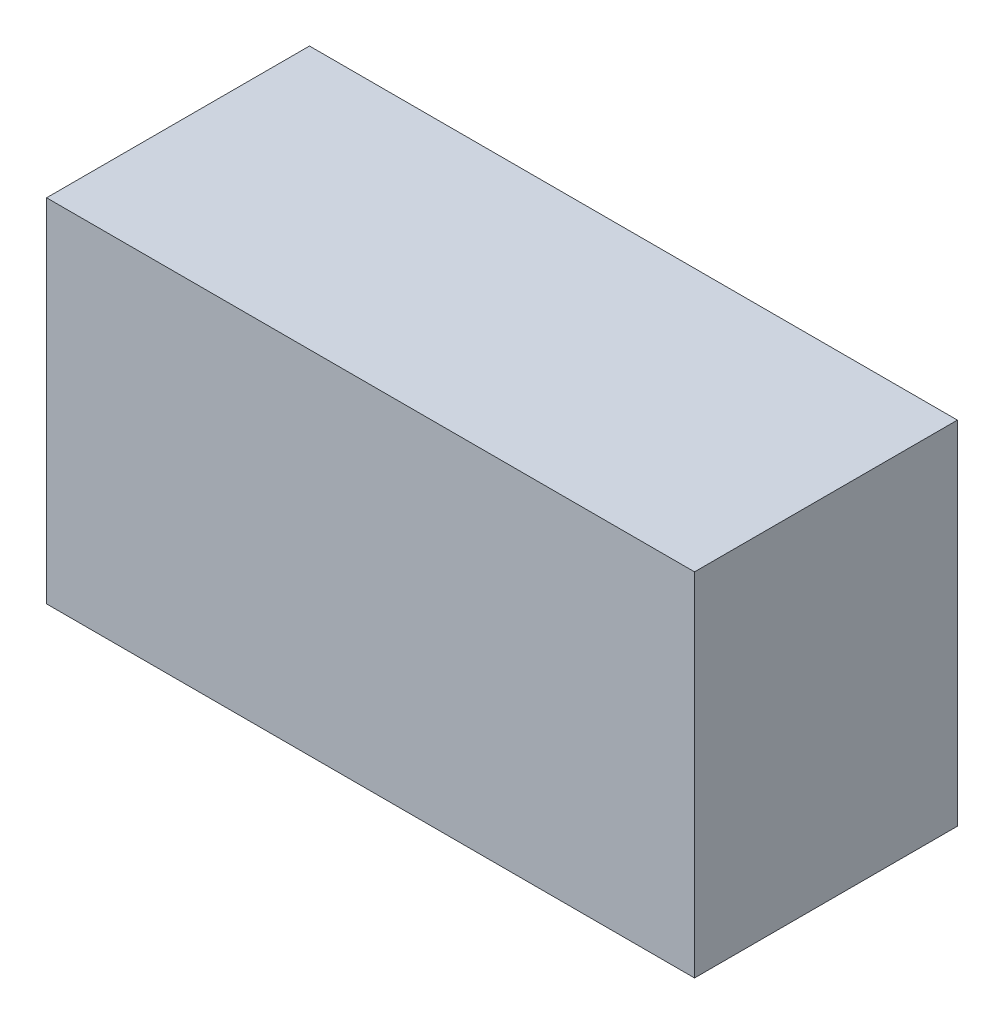
ISO-10303-21;
HEADER;
FILE_DESCRIPTION(('STEP AP214'),'2;1');
FILE_NAME('part.step','',(''),(''),'','','');
FILE_SCHEMA(('AUTOMOTIVE_DESIGN { 1 0 10303 214 1 1 1 1 }'));
ENDSEC;
DATA;
#1=APPLICATION_CONTEXT('core data for automotive mechanical design processes');
#2=APPLICATION_PROTOCOL_DEFINITION('international standard','automotive_design',2000,#1);
#3=PRODUCT_CONTEXT('',#1,'mechanical');
#4=PRODUCT('Part','Part','',(#3));
#5=PRODUCT_RELATED_PRODUCT_CATEGORY('part','',(#4));
#6=PRODUCT_DEFINITION_FORMATION('','',#4);
#7=PRODUCT_DEFINITION_CONTEXT('part definition',#1,'design');
#8=PRODUCT_DEFINITION('design','',#6,#7);
#9=PRODUCT_DEFINITION_SHAPE('','',#8);
#10=(LENGTH_UNIT() NAMED_UNIT(*) SI_UNIT(.MILLI.,.METRE.));
#11=(NAMED_UNIT(*) PLANE_ANGLE_UNIT() SI_UNIT($,.RADIAN.));
#12=(NAMED_UNIT(*) SI_UNIT($,.STERADIAN.) SOLID_ANGLE_UNIT());
#13=UNCERTAINTY_MEASURE_WITH_UNIT(LENGTH_MEASURE(1.E-05),#10,'distance_accuracy_value','');
#14=(GEOMETRIC_REPRESENTATION_CONTEXT(3) GLOBAL_UNCERTAINTY_ASSIGNED_CONTEXT((#13)) GLOBAL_UNIT_ASSIGNED_CONTEXT((#10,
#11,#12)) REPRESENTATION_CONTEXT('',''));
#15=CARTESIAN_POINT('',(0.,0.,0.));
#16=DIRECTION('',(0.,0.,1.));
#17=DIRECTION('',(1.,0.,0.));
#18=AXIS2_PLACEMENT_3D('',#15,#16,#17);
#19=CARTESIAN_POINT('',(-0.87499952,-0.47500032,0.));
#20=DIRECTION('',(0.,1.,0.));
#21=DIRECTION('',(1.,0.,0.));
#22=AXIS2_PLACEMENT_3D('',#19,#20,#21);
#23=PLANE('',#22);
#24=DIRECTION('',(1.,0.,0.));
#25=VECTOR('',#24,1.);
#26=CARTESIAN_POINT('',(-0.87499952,-0.47500032,0.));
#27=LINE('',#26,#25);
#28=CARTESIAN_POINT('',(-0.87499952,-0.47500032,0.));
#29=VERTEX_POINT('',#28);
#30=CARTESIAN_POINT('',(0.87499952,-0.47500032,0.));
#31=VERTEX_POINT('',#30);
#32=EDGE_CURVE('E9',#29,#31,#27,.T.);
#33=ORIENTED_EDGE('',*,*,#32,.T.);
#34=DIRECTION('',(0.,0.,1.));
#35=VECTOR('',#34,1.);
#36=CARTESIAN_POINT('',(0.87499952,-0.47500032,0.));
#37=LINE('',#36,#35);
#38=CARTESIAN_POINT('',(0.87499952,-0.47500032,0.71000112));
#39=VERTEX_POINT('',#38);
#40=EDGE_CURVE('E22',#31,#39,#37,.T.);
#41=ORIENTED_EDGE('',*,*,#40,.T.);
#42=DIRECTION('',(1.,0.,0.));
#43=VECTOR('',#42,1.);
#44=CARTESIAN_POINT('',(-0.87499952,-0.47500032,0.71000112));
#45=LINE('',#44,#43);
#46=CARTESIAN_POINT('',(-0.87499952,-0.47500032,0.71000112));
#47=VERTEX_POINT('',#46);
#48=EDGE_CURVE('E84',#47,#39,#45,.T.);
#49=ORIENTED_EDGE('',*,*,#48,.F.);
#50=DIRECTION('',(0.,0.,1.));
#51=VECTOR('',#50,1.);
#52=CARTESIAN_POINT('',(-0.87499952,-0.47500032,0.));
#53=LINE('',#52,#51);
#54=EDGE_CURVE('E32',#29,#47,#53,.T.);
#55=ORIENTED_EDGE('',*,*,#54,.F.);
#56=EDGE_LOOP('',(#33,#41,#49,#55));
#57=FACE_BOUND('',#56,.T.);
#58=ADVANCED_FACE('F15',(#57),#23,.F.);
#59=CARTESIAN_POINT('',(0.87499952,-0.47500032,0.));
#60=DIRECTION('',(-1.,0.,0.));
#61=DIRECTION('',(0.,1.,0.));
#62=AXIS2_PLACEMENT_3D('',#59,#60,#61);
#63=PLANE('',#62);
#64=DIRECTION('',(0.,1.,0.));
#65=VECTOR('',#64,1.);
#66=CARTESIAN_POINT('',(0.87499952,-0.47500032,0.));
#67=LINE('',#66,#65);
#68=CARTESIAN_POINT('',(0.87499952,0.47500032,0.));
#69=VERTEX_POINT('',#68);
#70=EDGE_CURVE('E81',#31,#69,#67,.T.);
#71=ORIENTED_EDGE('',*,*,#70,.T.);
#72=DIRECTION('',(0.,0.,1.));
#73=VECTOR('',#72,1.);
#74=CARTESIAN_POINT('',(0.87499952,0.47500032,0.));
#75=LINE('',#74,#73);
#76=CARTESIAN_POINT('',(0.87499952,0.47500032,0.71000112));
#77=VERTEX_POINT('',#76);
#78=EDGE_CURVE('E79',#69,#77,#75,.T.);
#79=ORIENTED_EDGE('',*,*,#78,.T.);
#80=DIRECTION('',(0.,1.,0.));
#81=VECTOR('',#80,1.);
#82=CARTESIAN_POINT('',(0.87499952,-0.47500032,0.71000112));
#83=LINE('',#82,#81);
#84=EDGE_CURVE('E58',#39,#77,#83,.T.);
#85=ORIENTED_EDGE('',*,*,#84,.F.);
#86=ORIENTED_EDGE('',*,*,#40,.F.);
#87=EDGE_LOOP('',(#71,#79,#85,#86));
#88=FACE_BOUND('',#87,.T.);
#89=ADVANCED_FACE('F87',(#88),#63,.F.);
#90=CARTESIAN_POINT('',(0.87499952,0.47500032,0.));
#91=DIRECTION('',(0.,-1.,0.));
#92=DIRECTION('',(-1.,0.,0.));
#93=AXIS2_PLACEMENT_3D('',#90,#91,#92);
#94=PLANE('',#93);
#95=DIRECTION('',(-1.,0.,0.));
#96=VECTOR('',#95,1.);
#97=CARTESIAN_POINT('',(0.87499952,0.47500032,0.));
#98=LINE('',#97,#96);
#99=CARTESIAN_POINT('',(-0.87499952,0.47500032,0.));
#100=VERTEX_POINT('',#99);
#101=EDGE_CURVE('E68',#69,#100,#98,.T.);
#102=ORIENTED_EDGE('',*,*,#101,.T.);
#103=DIRECTION('',(0.,0.,1.));
#104=VECTOR('',#103,1.);
#105=CARTESIAN_POINT('',(-0.87499952,0.47500032,0.));
#106=LINE('',#105,#104);
#107=CARTESIAN_POINT('',(-0.87499952,0.47500032,0.71000112));
#108=VERTEX_POINT('',#107);
#109=EDGE_CURVE('E62',#100,#108,#106,.T.);
#110=ORIENTED_EDGE('',*,*,#109,.T.);
#111=DIRECTION('',(-1.,0.,0.));
#112=VECTOR('',#111,1.);
#113=CARTESIAN_POINT('',(0.87499952,0.47500032,0.71000112));
#114=LINE('',#113,#112);
#115=EDGE_CURVE('E52',#77,#108,#114,.T.);
#116=ORIENTED_EDGE('',*,*,#115,.F.);
#117=ORIENTED_EDGE('',*,*,#78,.F.);
#118=EDGE_LOOP('',(#102,#110,#116,#117));
#119=FACE_BOUND('',#118,.T.);
#120=ADVANCED_FACE('F66',(#119),#94,.F.);
#121=CARTESIAN_POINT('',(-0.87499952,0.47500032,0.));
#122=DIRECTION('',(1.,0.,0.));
#123=DIRECTION('',(0.,-1.,0.));
#124=AXIS2_PLACEMENT_3D('',#121,#122,#123);
#125=PLANE('',#124);
#126=DIRECTION('',(0.,-1.,0.));
#127=VECTOR('',#126,1.);
#128=CARTESIAN_POINT('',(-0.87499952,0.47500032,0.));
#129=LINE('',#128,#127);
#130=EDGE_CURVE('E63',#100,#29,#129,.T.);
#131=ORIENTED_EDGE('',*,*,#130,.T.);
#132=ORIENTED_EDGE('',*,*,#54,.T.);
#133=DIRECTION('',(0.,-1.,0.));
#134=VECTOR('',#133,1.);
#135=CARTESIAN_POINT('',(-0.87499952,0.47500032,0.71000112));
#136=LINE('',#135,#134);
#137=EDGE_CURVE('E56',#108,#47,#136,.T.);
#138=ORIENTED_EDGE('',*,*,#137,.F.);
#139=ORIENTED_EDGE('',*,*,#109,.F.);
#140=EDGE_LOOP('',(#131,#132,#138,#139));
#141=FACE_BOUND('',#140,.T.);
#142=ADVANCED_FACE('F73',(#141),#125,.F.);
#143=CARTESIAN_POINT('',(-0.87499952,-0.47500032,0.));
#144=DIRECTION('',(0.,0.,-1.));
#145=DIRECTION('',(-1.,0.,0.));
#146=AXIS2_PLACEMENT_3D('',#143,#144,#145);
#147=PLANE('',#146);
#148=ORIENTED_EDGE('',*,*,#130,.F.);
#149=ORIENTED_EDGE('',*,*,#101,.F.);
#150=ORIENTED_EDGE('',*,*,#70,.F.);
#151=ORIENTED_EDGE('',*,*,#32,.F.);
#152=EDGE_LOOP('',(#148,#149,#150,#151));
#153=FACE_BOUND('',#152,.T.);
#154=ADVANCED_FACE('F89',(#153),#147,.T.);
#155=CARTESIAN_POINT('',(-0.87499952,-0.47500032,0.71000112));
#156=DIRECTION('',(0.,0.,-1.));
#157=DIRECTION('',(-1.,0.,0.));
#158=AXIS2_PLACEMENT_3D('',#155,#156,#157);
#159=PLANE('',#158);
#160=ORIENTED_EDGE('',*,*,#48,.T.);
#161=ORIENTED_EDGE('',*,*,#84,.T.);
#162=ORIENTED_EDGE('',*,*,#115,.T.);
#163=ORIENTED_EDGE('',*,*,#137,.T.);
#164=EDGE_LOOP('',(#160,#161,#162,#163));
#165=FACE_BOUND('',#164,.T.);
#166=ADVANCED_FACE('F54',(#165),#159,.F.);
#167=CLOSED_SHELL('',(#58,#89,#120,#142,#154,#166));
#168=MANIFOLD_SOLID_BREP('B1',#167);
#169=ADVANCED_BREP_SHAPE_REPRESENTATION('',(#18,#168),#14);
#170=SHAPE_DEFINITION_REPRESENTATION(#9,#169);
ENDSEC;
END-ISO-10303-21;
